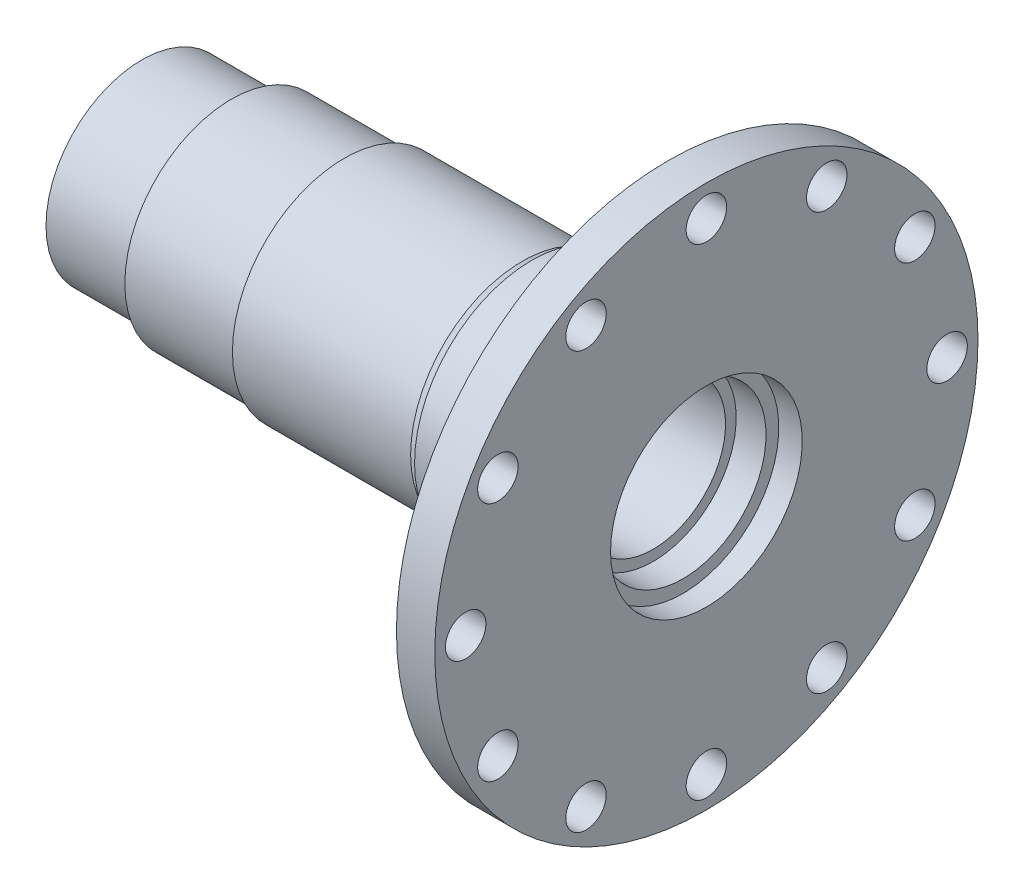
ISO-10303-21;
HEADER;
FILE_DESCRIPTION(('STEP AP214'),'2;1');
FILE_NAME('part.step','',(''),(''),'','','');
FILE_SCHEMA(('AUTOMOTIVE_DESIGN { 1 0 10303 214 1 1 1 1 }'));
ENDSEC;
DATA;
#1=APPLICATION_CONTEXT('core data for automotive mechanical design processes');
#2=APPLICATION_PROTOCOL_DEFINITION('international standard','automotive_design',2000,#1);
#3=PRODUCT_CONTEXT('',#1,'mechanical');
#4=PRODUCT('Part','Part','',(#3));
#5=PRODUCT_RELATED_PRODUCT_CATEGORY('part','',(#4));
#6=PRODUCT_DEFINITION_FORMATION('','',#4);
#7=PRODUCT_DEFINITION_CONTEXT('part definition',#1,'design');
#8=PRODUCT_DEFINITION('design','',#6,#7);
#9=PRODUCT_DEFINITION_SHAPE('','',#8);
#10=(LENGTH_UNIT() NAMED_UNIT(*) SI_UNIT(.MILLI.,.METRE.));
#11=(NAMED_UNIT(*) PLANE_ANGLE_UNIT() SI_UNIT($,.RADIAN.));
#12=(NAMED_UNIT(*) SI_UNIT($,.STERADIAN.) SOLID_ANGLE_UNIT());
#13=UNCERTAINTY_MEASURE_WITH_UNIT(LENGTH_MEASURE(1.E-05),#10,'distance_accuracy_value','');
#14=(GEOMETRIC_REPRESENTATION_CONTEXT(3) GLOBAL_UNCERTAINTY_ASSIGNED_CONTEXT((#13)) GLOBAL_UNIT_ASSIGNED_CONTEXT((#10,
#11,#12)) REPRESENTATION_CONTEXT('',''));
#15=CARTESIAN_POINT('',(0.,0.,0.));
#16=DIRECTION('',(0.,0.,1.));
#17=DIRECTION('',(1.,0.,0.));
#18=AXIS2_PLACEMENT_3D('',#15,#16,#17);
#19=CARTESIAN_POINT('',(0.,0.,0.));
#20=DIRECTION('',(1.,0.,0.));
#21=DIRECTION('',(0.,0.,-1.));
#22=AXIS2_PLACEMENT_3D('',#19,#20,#21);
#23=PLANE('',#22);
#24=CARTESIAN_POINT('',(0.,0.,0.));
#25=DIRECTION('',(-1.,0.,0.));
#26=DIRECTION('',(0.,0.,1.));
#27=AXIS2_PLACEMENT_3D('',#24,#25,#26);
#28=CIRCLE('',#27,31.);
#29=CARTESIAN_POINT('',(0.,0.,31.));
#30=VERTEX_POINT('',#29);
#31=EDGE_CURVE('E138',#30,#30,#28,.T.);
#32=ORIENTED_EDGE('',*,*,#31,.F.);
#33=EDGE_LOOP('',(#32));
#34=FACE_BOUND('',#33,.T.);
#35=CARTESIAN_POINT('',(0.,0.,0.));
#36=DIRECTION('',(-1.,0.,0.));
#37=DIRECTION('',(0.,0.,1.));
#38=AXIS2_PLACEMENT_3D('',#35,#36,#37);
#39=CIRCLE('',#38,45.);
#40=CARTESIAN_POINT('',(0.,0.,45.));
#41=VERTEX_POINT('',#40);
#42=EDGE_CURVE('E11',#41,#41,#39,.T.);
#43=ORIENTED_EDGE('',*,*,#42,.T.);
#44=EDGE_LOOP('',(#43));
#45=FACE_BOUND('',#44,.T.);
#46=ADVANCED_FACE('F50',(#34,#45),#23,.F.);
#47=CARTESIAN_POINT('',(0.,0.,0.));
#48=DIRECTION('',(-1.,0.,0.));
#49=DIRECTION('',(0.,0.,1.));
#50=AXIS2_PLACEMENT_3D('',#47,#48,#49);
#51=CYLINDRICAL_SURFACE('',#50,45.);
#52=ORIENTED_EDGE('',*,*,#42,.F.);
#53=EDGE_LOOP('',(#52));
#54=FACE_BOUND('',#53,.T.);
#55=CARTESIAN_POINT('',(42.,0.,0.));
#56=DIRECTION('',(-1.,0.,0.));
#57=DIRECTION('',(0.,0.,1.));
#58=AXIS2_PLACEMENT_3D('',#55,#56,#57);
#59=CIRCLE('',#58,45.);
#60=CARTESIAN_POINT('',(42.,0.,45.));
#61=VERTEX_POINT('',#60);
#62=EDGE_CURVE('E59',#61,#61,#59,.T.);
#63=ORIENTED_EDGE('',*,*,#62,.T.);
#64=EDGE_LOOP('',(#63));
#65=FACE_BOUND('',#64,.T.);
#66=ADVANCED_FACE('F339',(#54,#65),#51,.T.);
#67=CARTESIAN_POINT('',(42.,45.,0.));
#68=DIRECTION('',(1.,0.,0.));
#69=DIRECTION('',(0.,0.,-1.));
#70=AXIS2_PLACEMENT_3D('',#67,#68,#69);
#71=PLANE('',#70);
#72=ORIENTED_EDGE('',*,*,#62,.F.);
#73=EDGE_LOOP('',(#72));
#74=FACE_BOUND('',#73,.T.);
#75=CARTESIAN_POINT('',(42.,0.,0.));
#76=DIRECTION('',(-1.,0.,0.));
#77=DIRECTION('',(0.,0.,1.));
#78=AXIS2_PLACEMENT_3D('',#75,#76,#77);
#79=CIRCLE('',#78,50.);
#80=CARTESIAN_POINT('',(42.,0.,50.));
#81=VERTEX_POINT('',#80);
#82=EDGE_CURVE('E64',#81,#81,#79,.T.);
#83=ORIENTED_EDGE('',*,*,#82,.T.);
#84=EDGE_LOOP('',(#83));
#85=FACE_BOUND('',#84,.T.);
#86=ADVANCED_FACE('F343',(#74,#85),#71,.F.);
#87=CARTESIAN_POINT('',(0.,0.,0.));
#88=DIRECTION('',(-1.,0.,0.));
#89=DIRECTION('',(0.,0.,1.));
#90=AXIS2_PLACEMENT_3D('',#87,#88,#89);
#91=CYLINDRICAL_SURFACE('',#90,50.);
#92=ORIENTED_EDGE('',*,*,#82,.F.);
#93=EDGE_LOOP('',(#92));
#94=FACE_BOUND('',#93,.T.);
#95=CARTESIAN_POINT('',(95.,0.,0.));
#96=DIRECTION('',(-1.,0.,0.));
#97=DIRECTION('',(0.,0.,1.));
#98=AXIS2_PLACEMENT_3D('',#95,#96,#97);
#99=CIRCLE('',#98,50.);
#100=CARTESIAN_POINT('',(95.,0.,50.));
#101=VERTEX_POINT('',#100);
#102=EDGE_CURVE('E69',#101,#101,#99,.T.);
#103=ORIENTED_EDGE('',*,*,#102,.T.);
#104=EDGE_LOOP('',(#103));
#105=FACE_BOUND('',#104,.T.);
#106=ADVANCED_FACE('F428',(#94,#105),#91,.T.);
#107=CARTESIAN_POINT('',(95.,50.,0.));
#108=DIRECTION('',(1.,0.,0.));
#109=DIRECTION('',(0.,0.,-1.));
#110=AXIS2_PLACEMENT_3D('',#107,#108,#109);
#111=PLANE('',#110);
#112=ORIENTED_EDGE('',*,*,#102,.F.);
#113=EDGE_LOOP('',(#112));
#114=FACE_BOUND('',#113,.T.);
#115=CARTESIAN_POINT('',(95.,0.,0.));
#116=DIRECTION('',(-1.,0.,0.));
#117=DIRECTION('',(0.,0.,1.));
#118=AXIS2_PLACEMENT_3D('',#115,#116,#117);
#119=CIRCLE('',#118,52.5);
#120=CARTESIAN_POINT('',(95.,0.,52.5));
#121=VERTEX_POINT('',#120);
#122=EDGE_CURVE('E84',#121,#121,#119,.T.);
#123=ORIENTED_EDGE('',*,*,#122,.T.);
#124=EDGE_LOOP('',(#123));
#125=FACE_BOUND('',#124,.T.);
#126=ADVANCED_FACE('F423',(#114,#125),#111,.F.);
#127=CARTESIAN_POINT('',(0.,0.,0.));
#128=DIRECTION('',(-1.,0.,0.));
#129=DIRECTION('',(0.,0.,1.));
#130=AXIS2_PLACEMENT_3D('',#127,#128,#129);
#131=CYLINDRICAL_SURFACE('',#130,52.5);
#132=ORIENTED_EDGE('',*,*,#122,.F.);
#133=EDGE_LOOP('',(#132));
#134=FACE_BOUND('',#133,.T.);
#135=CARTESIAN_POINT('',(178.669872981078,0.,0.));
#136=DIRECTION('',(-1.,0.,0.));
#137=DIRECTION('',(0.,0.,1.));
#138=AXIS2_PLACEMENT_3D('',#135,#136,#137);
#139=CIRCLE('',#138,52.5);
#140=CARTESIAN_POINT('',(178.669872981078,0.,52.5));
#141=VERTEX_POINT('',#140);
#142=EDGE_CURVE('E89',#141,#141,#139,.T.);
#143=ORIENTED_EDGE('',*,*,#142,.T.);
#144=EDGE_LOOP('',(#143));
#145=FACE_BOUND('',#144,.T.);
#146=ADVANCED_FACE('F418',(#134,#145),#131,.T.);
#147=CARTESIAN_POINT('',(183.,0.,0.));
#148=DIRECTION('',(1.,0.,0.));
#149=DIRECTION('',(0.,0.,-1.));
#150=AXIS2_PLACEMENT_3D('',#147,#148,#149);
#151=CONICAL_SURFACE('',#150,55.,0.5235987755983);
#152=ORIENTED_EDGE('',*,*,#142,.F.);
#153=EDGE_LOOP('',(#152));
#154=FACE_BOUND('',#153,.T.);
#155=CARTESIAN_POINT('',(183.,0.,0.));
#156=DIRECTION('',(-1.,0.,0.));
#157=DIRECTION('',(0.,0.,1.));
#158=AXIS2_PLACEMENT_3D('',#155,#156,#157);
#159=CIRCLE('',#158,55.);
#160=CARTESIAN_POINT('',(183.,0.,55.));
#161=VERTEX_POINT('',#160);
#162=EDGE_CURVE('E94',#161,#161,#159,.T.);
#163=ORIENTED_EDGE('',*,*,#162,.T.);
#164=EDGE_LOOP('',(#163));
#165=FACE_BOUND('',#164,.T.);
#166=ADVANCED_FACE('F413',(#154,#165),#151,.T.);
#167=CARTESIAN_POINT('',(0.,0.,0.));
#168=DIRECTION('',(-1.,0.,0.));
#169=DIRECTION('',(0.,0.,1.));
#170=AXIS2_PLACEMENT_3D('',#167,#168,#169);
#171=CYLINDRICAL_SURFACE('',#170,55.);
#172=ORIENTED_EDGE('',*,*,#162,.F.);
#173=EDGE_LOOP('',(#172));
#174=FACE_BOUND('',#173,.T.);
#175=CARTESIAN_POINT('',(215.,0.,0.));
#176=DIRECTION('',(-1.,0.,0.));
#177=DIRECTION('',(0.,0.,1.));
#178=AXIS2_PLACEMENT_3D('',#175,#176,#177);
#179=CIRCLE('',#178,55.);
#180=CARTESIAN_POINT('',(215.,0.,55.));
#181=VERTEX_POINT('',#180);
#182=EDGE_CURVE('E102',#181,#181,#179,.T.);
#183=ORIENTED_EDGE('',*,*,#182,.T.);
#184=EDGE_LOOP('',(#183));
#185=FACE_BOUND('',#184,.T.);
#186=ADVANCED_FACE('F408',(#174,#185),#171,.T.);
#187=CARTESIAN_POINT('',(215.,55.,0.));
#188=DIRECTION('',(1.,0.,0.));
#189=DIRECTION('',(0.,0.,-1.));
#190=AXIS2_PLACEMENT_3D('',#187,#188,#189);
#191=PLANE('',#190);
#192=ORIENTED_EDGE('',*,*,#182,.F.);
#193=EDGE_LOOP('',(#192));
#194=FACE_BOUND('',#193,.T.);
#195=CARTESIAN_POINT('',(215.,0.,0.));
#196=DIRECTION('',(-1.,0.,0.));
#197=DIRECTION('',(0.,0.,1.));
#198=AXIS2_PLACEMENT_3D('',#195,#196,#197);
#199=CIRCLE('',#198,62.5);
#200=CARTESIAN_POINT('',(215.,0.,62.5));
#201=VERTEX_POINT('',#200);
#202=EDGE_CURVE('E106',#201,#201,#199,.T.);
#203=ORIENTED_EDGE('',*,*,#202,.T.);
#204=EDGE_LOOP('',(#203));
#205=FACE_BOUND('',#204,.T.);
#206=ADVANCED_FACE('F403',(#194,#205),#191,.F.);
#207=CARTESIAN_POINT('',(0.,0.,0.));
#208=DIRECTION('',(-1.,0.,0.));
#209=DIRECTION('',(0.,0.,1.));
#210=AXIS2_PLACEMENT_3D('',#207,#208,#209);
#211=CYLINDRICAL_SURFACE('',#210,62.5);
#212=ORIENTED_EDGE('',*,*,#202,.F.);
#213=EDGE_LOOP('',(#212));
#214=FACE_BOUND('',#213,.T.);
#215=CARTESIAN_POINT('',(239.,0.,0.));
#216=DIRECTION('',(-1.,0.,0.));
#217=DIRECTION('',(0.,0.,1.));
#218=AXIS2_PLACEMENT_3D('',#215,#216,#217);
#219=CIRCLE('',#218,62.5);
#220=CARTESIAN_POINT('',(239.,0.,62.5));
#221=VERTEX_POINT('',#220);
#222=EDGE_CURVE('E111',#221,#221,#219,.T.);
#223=ORIENTED_EDGE('',*,*,#222,.T.);
#224=EDGE_LOOP('',(#223));
#225=FACE_BOUND('',#224,.T.);
#226=ADVANCED_FACE('F391',(#214,#225),#211,.T.);
#227=CARTESIAN_POINT('',(239.,62.5,0.));
#228=DIRECTION('',(1.,0.,0.));
#229=DIRECTION('',(0.,0.,-1.));
#230=AXIS2_PLACEMENT_3D('',#227,#228,#229);
#231=PLANE('',#230);
#232=ORIENTED_EDGE('',*,*,#222,.F.);
#233=EDGE_LOOP('',(#232));
#234=FACE_BOUND('',#233,.T.);
#235=CARTESIAN_POINT('',(239.,0.,0.));
#236=DIRECTION('',(-1.,0.,0.));
#237=DIRECTION('',(0.,0.,1.));
#238=AXIS2_PLACEMENT_3D('',#235,#236,#237);
#239=CIRCLE('',#238,100.);
#240=CARTESIAN_POINT('',(239.,0.,100.));
#241=VERTEX_POINT('',#240);
#242=EDGE_CURVE('E116',#241,#241,#239,.T.);
#243=ORIENTED_EDGE('',*,*,#242,.T.);
#244=EDGE_LOOP('',(#243));
#245=FACE_BOUND('',#244,.T.);
#246=ADVANCED_FACE('F386',(#234,#245),#231,.F.);
#247=CARTESIAN_POINT('',(0.,0.,0.));
#248=DIRECTION('',(-1.,0.,0.));
#249=DIRECTION('',(0.,0.,1.));
#250=AXIS2_PLACEMENT_3D('',#247,#248,#249);
#251=CYLINDRICAL_SURFACE('',#250,100.);
#252=ORIENTED_EDGE('',*,*,#242,.F.);
#253=EDGE_LOOP('',(#252));
#254=FACE_BOUND('',#253,.T.);
#255=CARTESIAN_POINT('',(247.,0.,0.));
#256=DIRECTION('',(-1.,0.,0.));
#257=DIRECTION('',(0.,0.,1.));
#258=AXIS2_PLACEMENT_3D('',#255,#256,#257);
#259=CIRCLE('',#258,100.);
#260=CARTESIAN_POINT('',(247.,0.,100.));
#261=VERTEX_POINT('',#260);
#262=EDGE_CURVE('E124',#261,#261,#259,.T.);
#263=ORIENTED_EDGE('',*,*,#262,.T.);
#264=EDGE_LOOP('',(#263));
#265=FACE_BOUND('',#264,.T.);
#266=ADVANCED_FACE('F333',(#254,#265),#251,.T.);
#267=CARTESIAN_POINT('',(247.,100.,0.));
#268=DIRECTION('',(1.,0.,0.));
#269=DIRECTION('',(0.,0.,-1.));
#270=AXIS2_PLACEMENT_3D('',#267,#268,#269);
#271=PLANE('',#270);
#272=CARTESIAN_POINT('',(247.,97.8608706276416,-56.5));
#273=DIRECTION('',(1.,0.,0.));
#274=DIRECTION('',(0.,0.,-1.));
#275=AXIS2_PLACEMENT_3D('',#272,#273,#274);
#276=CIRCLE('',#275,9.5);
#277=CARTESIAN_POINT('',(247.,97.8608706276416,-66.));
#278=VERTEX_POINT('',#277);
#279=EDGE_CURVE('E283',#278,#278,#276,.F.);
#280=ORIENTED_EDGE('',*,*,#279,.F.);
#281=EDGE_LOOP('',(#280));
#282=FACE_BOUND('',#281,.T.);
#283=CARTESIAN_POINT('',(247.,56.4999999999999,-97.8608706276416));
#284=DIRECTION('',(1.,0.,0.));
#285=DIRECTION('',(0.,0.,-1.));
#286=AXIS2_PLACEMENT_3D('',#283,#284,#285);
#287=CIRCLE('',#286,9.49999999999999);
#288=CARTESIAN_POINT('',(247.,56.4999999999999,-107.360870627642));
#289=VERTEX_POINT('',#288);
#290=EDGE_CURVE('E275',#289,#289,#287,.F.);
#291=ORIENTED_EDGE('',*,*,#290,.F.);
#292=EDGE_LOOP('',(#291));
#293=FACE_BOUND('',#292,.T.);
#294=CARTESIAN_POINT('',(247.,0.,-113.));
#295=DIRECTION('',(1.,0.,0.));
#296=DIRECTION('',(0.,0.,-1.));
#297=AXIS2_PLACEMENT_3D('',#294,#295,#296);
#298=CIRCLE('',#297,9.49999999999999);
#299=CARTESIAN_POINT('',(247.,0.,-122.5));
#300=VERTEX_POINT('',#299);
#301=EDGE_CURVE('E266',#300,#300,#298,.F.);
#302=ORIENTED_EDGE('',*,*,#301,.F.);
#303=EDGE_LOOP('',(#302));
#304=FACE_BOUND('',#303,.T.);
#305=CARTESIAN_POINT('',(247.,-56.5,-97.8608706276415));
#306=DIRECTION('',(1.,0.,0.));
#307=DIRECTION('',(0.,0.,-1.));
#308=AXIS2_PLACEMENT_3D('',#305,#306,#307);
#309=CIRCLE('',#308,9.49999999999999);
#310=CARTESIAN_POINT('',(247.,-56.5,-107.360870627642));
#311=VERTEX_POINT('',#310);
#312=EDGE_CURVE('E257',#311,#311,#309,.F.);
#313=ORIENTED_EDGE('',*,*,#312,.F.);
#314=EDGE_LOOP('',(#313));
#315=FACE_BOUND('',#314,.T.);
#316=CARTESIAN_POINT('',(247.,-97.8608706276416,-56.5));
#317=DIRECTION('',(1.,0.,0.));
#318=DIRECTION('',(0.,0.,-1.));
#319=AXIS2_PLACEMENT_3D('',#316,#317,#318);
#320=CIRCLE('',#319,9.5);
#321=CARTESIAN_POINT('',(247.,-97.8608706276416,-66.));
#322=VERTEX_POINT('',#321);
#323=EDGE_CURVE('E249',#322,#322,#320,.F.);
#324=ORIENTED_EDGE('',*,*,#323,.F.);
#325=EDGE_LOOP('',(#324));
#326=FACE_BOUND('',#325,.T.);
#327=CARTESIAN_POINT('',(247.,-113.,0.));
#328=DIRECTION('',(1.,0.,0.));
#329=DIRECTION('',(0.,0.,-1.));
#330=AXIS2_PLACEMENT_3D('',#327,#328,#329);
#331=CIRCLE('',#330,9.5);
#332=CARTESIAN_POINT('',(247.,-113.,-9.49999999999998));
#333=VERTEX_POINT('',#332);
#334=EDGE_CURVE('E238',#333,#333,#331,.F.);
#335=ORIENTED_EDGE('',*,*,#334,.F.);
#336=EDGE_LOOP('',(#335));
#337=FACE_BOUND('',#336,.T.);
#338=CARTESIAN_POINT('',(247.,-97.8608706276415,56.5));
#339=DIRECTION('',(1.,0.,0.));
#340=DIRECTION('',(0.,0.,-1.));
#341=AXIS2_PLACEMENT_3D('',#338,#339,#340);
#342=CIRCLE('',#341,9.5);
#343=CARTESIAN_POINT('',(247.,-97.8608706276415,47.));
#344=VERTEX_POINT('',#343);
#345=EDGE_CURVE('E229',#344,#344,#342,.F.);
#346=ORIENTED_EDGE('',*,*,#345,.F.);
#347=EDGE_LOOP('',(#346));
#348=FACE_BOUND('',#347,.T.);
#349=CARTESIAN_POINT('',(247.,-56.5,97.8608706276416));
#350=DIRECTION('',(1.,0.,0.));
#351=DIRECTION('',(0.,0.,-1.));
#352=AXIS2_PLACEMENT_3D('',#349,#350,#351);
#353=CIRCLE('',#352,9.49999999999999);
#354=CARTESIAN_POINT('',(247.,-56.5,88.3608706276416));
#355=VERTEX_POINT('',#354);
#356=EDGE_CURVE('E221',#355,#355,#353,.F.);
#357=ORIENTED_EDGE('',*,*,#356,.F.);
#358=EDGE_LOOP('',(#357));
#359=FACE_BOUND('',#358,.T.);
#360=CARTESIAN_POINT('',(247.,0.,113.));
#361=DIRECTION('',(1.,0.,0.));
#362=DIRECTION('',(0.,0.,-1.));
#363=AXIS2_PLACEMENT_3D('',#360,#361,#362);
#364=CIRCLE('',#363,9.49999999999999);
#365=CARTESIAN_POINT('',(247.,0.,103.5));
#366=VERTEX_POINT('',#365);
#367=EDGE_CURVE('E210',#366,#366,#364,.F.);
#368=ORIENTED_EDGE('',*,*,#367,.F.);
#369=EDGE_LOOP('',(#368));
#370=FACE_BOUND('',#369,.T.);
#371=CARTESIAN_POINT('',(247.,56.5,97.8608706276416));
#372=DIRECTION('',(1.,0.,0.));
#373=DIRECTION('',(0.,0.,-1.));
#374=AXIS2_PLACEMENT_3D('',#371,#372,#373);
#375=CIRCLE('',#374,9.49999999999999);
#376=CARTESIAN_POINT('',(247.,56.5,88.3608706276416));
#377=VERTEX_POINT('',#376);
#378=EDGE_CURVE('E201',#377,#377,#375,.F.);
#379=ORIENTED_EDGE('',*,*,#378,.F.);
#380=EDGE_LOOP('',(#379));
#381=FACE_BOUND('',#380,.T.);
#382=CARTESIAN_POINT('',(247.,97.8608706276416,56.5));
#383=DIRECTION('',(1.,0.,0.));
#384=DIRECTION('',(0.,0.,-1.));
#385=AXIS2_PLACEMENT_3D('',#382,#383,#384);
#386=CIRCLE('',#385,9.5);
#387=CARTESIAN_POINT('',(247.,97.8608706276416,47.));
#388=VERTEX_POINT('',#387);
#389=EDGE_CURVE('E193',#388,#388,#386,.F.);
#390=ORIENTED_EDGE('',*,*,#389,.F.);
#391=EDGE_LOOP('',(#390));
#392=FACE_BOUND('',#391,.T.);
#393=CARTESIAN_POINT('',(247.,113.,0.));
#394=DIRECTION('',(1.,0.,0.));
#395=DIRECTION('',(0.,0.,-1.));
#396=AXIS2_PLACEMENT_3D('',#393,#394,#395);
#397=CIRCLE('',#396,9.5);
#398=CARTESIAN_POINT('',(247.,113.,-9.50000000000001));
#399=VERTEX_POINT('',#398);
#400=EDGE_CURVE('E182',#399,#399,#397,.F.);
#401=ORIENTED_EDGE('',*,*,#400,.F.);
#402=EDGE_LOOP('',(#401));
#403=FACE_BOUND('',#402,.T.);
#404=ORIENTED_EDGE('',*,*,#262,.F.);
#405=EDGE_LOOP('',(#404));
#406=FACE_BOUND('',#405,.T.);
#407=CARTESIAN_POINT('',(247.,0.,0.));
#408=DIRECTION('',(-1.,0.,0.));
#409=DIRECTION('',(0.,0.,1.));
#410=AXIS2_PLACEMENT_3D('',#407,#408,#409);
#411=CIRCLE('',#410,127.5);
#412=CARTESIAN_POINT('',(247.,0.,127.5));
#413=VERTEX_POINT('',#412);
#414=EDGE_CURVE('E128',#413,#413,#411,.T.);
#415=ORIENTED_EDGE('',*,*,#414,.T.);
#416=EDGE_LOOP('',(#415));
#417=FACE_BOUND('',#416,.T.);
#418=ADVANCED_FACE('F328',(#282,#293,#304,#315,#326,#337,#348,#359,#370,#381,#392,#403,#406,
#417),#271,.F.);
#419=CARTESIAN_POINT('',(0.,0.,0.));
#420=DIRECTION('',(-1.,0.,0.));
#421=DIRECTION('',(0.,0.,1.));
#422=AXIS2_PLACEMENT_3D('',#419,#420,#421);
#423=CYLINDRICAL_SURFACE('',#422,127.5);
#424=ORIENTED_EDGE('',*,*,#414,.F.);
#425=EDGE_LOOP('',(#424));
#426=FACE_BOUND('',#425,.T.);
#427=CARTESIAN_POINT('',(265.,0.,0.));
#428=DIRECTION('',(-1.,0.,0.));
#429=DIRECTION('',(0.,0.,1.));
#430=AXIS2_PLACEMENT_3D('',#427,#428,#429);
#431=CIRCLE('',#430,127.5);
#432=CARTESIAN_POINT('',(265.,0.,127.5));
#433=VERTEX_POINT('',#432);
#434=EDGE_CURVE('E133',#433,#433,#431,.T.);
#435=ORIENTED_EDGE('',*,*,#434,.T.);
#436=EDGE_LOOP('',(#435));
#437=FACE_BOUND('',#436,.T.);
#438=ADVANCED_FACE('F299',(#426,#437),#423,.T.);
#439=CARTESIAN_POINT('',(265.,127.5,0.));
#440=DIRECTION('',(-1.,0.,0.));
#441=DIRECTION('',(0.,0.,1.));
#442=AXIS2_PLACEMENT_3D('',#439,#440,#441);
#443=PLANE('',#442);
#444=CARTESIAN_POINT('',(265.,97.8608706276416,-56.5));
#445=DIRECTION('',(1.,0.,0.));
#446=DIRECTION('',(0.,0.,-1.));
#447=AXIS2_PLACEMENT_3D('',#444,#445,#446);
#448=CIRCLE('',#447,9.5);
#449=CARTESIAN_POINT('',(265.,97.8608706276416,-66.));
#450=VERTEX_POINT('',#449);
#451=EDGE_CURVE('E286',#450,#450,#448,.T.);
#452=ORIENTED_EDGE('',*,*,#451,.F.);
#453=EDGE_LOOP('',(#452));
#454=FACE_BOUND('',#453,.T.);
#455=CARTESIAN_POINT('',(265.,56.4999999999999,-97.8608706276416));
#456=DIRECTION('',(1.,0.,0.));
#457=DIRECTION('',(0.,0.,-1.));
#458=AXIS2_PLACEMENT_3D('',#455,#456,#457);
#459=CIRCLE('',#458,9.49999999999999);
#460=CARTESIAN_POINT('',(265.,56.4999999999999,-107.360870627642));
#461=VERTEX_POINT('',#460);
#462=EDGE_CURVE('E278',#461,#461,#459,.T.);
#463=ORIENTED_EDGE('',*,*,#462,.F.);
#464=EDGE_LOOP('',(#463));
#465=FACE_BOUND('',#464,.T.);
#466=CARTESIAN_POINT('',(265.,0.,-113.));
#467=DIRECTION('',(1.,0.,0.));
#468=DIRECTION('',(0.,0.,-1.));
#469=AXIS2_PLACEMENT_3D('',#466,#467,#468);
#470=CIRCLE('',#469,9.49999999999999);
#471=CARTESIAN_POINT('',(265.,0.,-122.5));
#472=VERTEX_POINT('',#471);
#473=EDGE_CURVE('E270',#472,#472,#470,.T.);
#474=ORIENTED_EDGE('',*,*,#473,.F.);
#475=EDGE_LOOP('',(#474));
#476=FACE_BOUND('',#475,.T.);
#477=CARTESIAN_POINT('',(265.,-56.5,-97.8608706276415));
#478=DIRECTION('',(1.,0.,0.));
#479=DIRECTION('',(0.,0.,-1.));
#480=AXIS2_PLACEMENT_3D('',#477,#478,#479);
#481=CIRCLE('',#480,9.49999999999999);
#482=CARTESIAN_POINT('',(265.,-56.5,-107.360870627642));
#483=VERTEX_POINT('',#482);
#484=EDGE_CURVE('E261',#483,#483,#481,.T.);
#485=ORIENTED_EDGE('',*,*,#484,.F.);
#486=EDGE_LOOP('',(#485));
#487=FACE_BOUND('',#486,.T.);
#488=CARTESIAN_POINT('',(265.,-97.8608706276416,-56.5));
#489=DIRECTION('',(1.,0.,0.));
#490=DIRECTION('',(0.,0.,-1.));
#491=AXIS2_PLACEMENT_3D('',#488,#489,#490);
#492=CIRCLE('',#491,9.5);
#493=CARTESIAN_POINT('',(265.,-97.8608706276416,-66.));
#494=VERTEX_POINT('',#493);
#495=EDGE_CURVE('E252',#494,#494,#492,.T.);
#496=ORIENTED_EDGE('',*,*,#495,.F.);
#497=EDGE_LOOP('',(#496));
#498=FACE_BOUND('',#497,.T.);
#499=CARTESIAN_POINT('',(265.,-113.,0.));
#500=DIRECTION('',(1.,0.,0.));
#501=DIRECTION('',(0.,0.,-1.));
#502=AXIS2_PLACEMENT_3D('',#499,#500,#501);
#503=CIRCLE('',#502,9.5);
#504=CARTESIAN_POINT('',(265.,-113.,-9.49999999999998));
#505=VERTEX_POINT('',#504);
#506=EDGE_CURVE('E244',#505,#505,#503,.T.);
#507=ORIENTED_EDGE('',*,*,#506,.F.);
#508=EDGE_LOOP('',(#507));
#509=FACE_BOUND('',#508,.T.);
#510=CARTESIAN_POINT('',(265.,-97.8608706276415,56.5));
#511=DIRECTION('',(1.,0.,0.));
#512=DIRECTION('',(0.,0.,-1.));
#513=AXIS2_PLACEMENT_3D('',#510,#511,#512);
#514=CIRCLE('',#513,9.5);
#515=CARTESIAN_POINT('',(265.,-97.8608706276415,47.));
#516=VERTEX_POINT('',#515);
#517=EDGE_CURVE('E233',#516,#516,#514,.T.);
#518=ORIENTED_EDGE('',*,*,#517,.F.);
#519=EDGE_LOOP('',(#518));
#520=FACE_BOUND('',#519,.T.);
#521=CARTESIAN_POINT('',(265.,-56.5,97.8608706276416));
#522=DIRECTION('',(1.,0.,0.));
#523=DIRECTION('',(0.,0.,-1.));
#524=AXIS2_PLACEMENT_3D('',#521,#522,#523);
#525=CIRCLE('',#524,9.49999999999999);
#526=CARTESIAN_POINT('',(265.,-56.5,88.3608706276416));
#527=VERTEX_POINT('',#526);
#528=EDGE_CURVE('E224',#527,#527,#525,.T.);
#529=ORIENTED_EDGE('',*,*,#528,.F.);
#530=EDGE_LOOP('',(#529));
#531=FACE_BOUND('',#530,.T.);
#532=CARTESIAN_POINT('',(265.,0.,113.));
#533=DIRECTION('',(1.,0.,0.));
#534=DIRECTION('',(0.,0.,-1.));
#535=AXIS2_PLACEMENT_3D('',#532,#533,#534);
#536=CIRCLE('',#535,9.49999999999999);
#537=CARTESIAN_POINT('',(265.,0.,103.5));
#538=VERTEX_POINT('',#537);
#539=EDGE_CURVE('E216',#538,#538,#536,.T.);
#540=ORIENTED_EDGE('',*,*,#539,.F.);
#541=EDGE_LOOP('',(#540));
#542=FACE_BOUND('',#541,.T.);
#543=CARTESIAN_POINT('',(265.,56.5,97.8608706276416));
#544=DIRECTION('',(1.,0.,0.));
#545=DIRECTION('',(0.,0.,-1.));
#546=AXIS2_PLACEMENT_3D('',#543,#544,#545);
#547=CIRCLE('',#546,9.49999999999999);
#548=CARTESIAN_POINT('',(265.,56.5,88.3608706276416));
#549=VERTEX_POINT('',#548);
#550=EDGE_CURVE('E205',#549,#549,#547,.T.);
#551=ORIENTED_EDGE('',*,*,#550,.F.);
#552=EDGE_LOOP('',(#551));
#553=FACE_BOUND('',#552,.T.);
#554=CARTESIAN_POINT('',(265.,97.8608706276416,56.5));
#555=DIRECTION('',(1.,0.,0.));
#556=DIRECTION('',(0.,0.,-1.));
#557=AXIS2_PLACEMENT_3D('',#554,#555,#556);
#558=CIRCLE('',#557,9.5);
#559=CARTESIAN_POINT('',(265.,97.8608706276416,47.));
#560=VERTEX_POINT('',#559);
#561=EDGE_CURVE('E196',#560,#560,#558,.T.);
#562=ORIENTED_EDGE('',*,*,#561,.F.);
#563=EDGE_LOOP('',(#562));
#564=FACE_BOUND('',#563,.T.);
#565=CARTESIAN_POINT('',(265.,113.,0.));
#566=DIRECTION('',(1.,0.,0.));
#567=DIRECTION('',(0.,0.,-1.));
#568=AXIS2_PLACEMENT_3D('',#565,#566,#567);
#569=CIRCLE('',#568,9.5);
#570=CARTESIAN_POINT('',(265.,113.,-9.50000000000001));
#571=VERTEX_POINT('',#570);
#572=EDGE_CURVE('E188',#571,#571,#569,.T.);
#573=ORIENTED_EDGE('',*,*,#572,.F.);
#574=EDGE_LOOP('',(#573));
#575=FACE_BOUND('',#574,.T.);
#576=CARTESIAN_POINT('',(265.,0.,0.));
#577=DIRECTION('',(-1.,0.,0.));
#578=DIRECTION('',(0.,0.,1.));
#579=AXIS2_PLACEMENT_3D('',#576,#577,#578);
#580=CIRCLE('',#579,45.);
#581=CARTESIAN_POINT('',(265.,0.,45.));
#582=VERTEX_POINT('',#581);
#583=EDGE_CURVE('E177',#582,#582,#580,.T.);
#584=ORIENTED_EDGE('',*,*,#583,.T.);
#585=EDGE_LOOP('',(#584));
#586=FACE_BOUND('',#585,.T.);
#587=ORIENTED_EDGE('',*,*,#434,.F.);
#588=EDGE_LOOP('',(#587));
#589=FACE_BOUND('',#588,.T.);
#590=ADVANCED_FACE('F295',(#454,#465,#476,#487,#498,#509,#520,#531,#542,#553,#564,#575,#586,
#589),#443,.F.);
#591=CARTESIAN_POINT('',(0.,0.,0.));
#592=DIRECTION('',(-1.,0.,0.));
#593=DIRECTION('',(0.,0.,1.));
#594=AXIS2_PLACEMENT_3D('',#591,#592,#593);
#595=CYLINDRICAL_SURFACE('',#594,31.);
#596=ORIENTED_EDGE('',*,*,#31,.T.);
#597=EDGE_LOOP('',(#596));
#598=FACE_BOUND('',#597,.T.);
#599=CARTESIAN_POINT('',(203.5,0.,0.));
#600=DIRECTION('',(-1.,0.,0.));
#601=DIRECTION('',(0.,0.,1.));
#602=AXIS2_PLACEMENT_3D('',#599,#600,#601);
#603=CIRCLE('',#602,31.);
#604=CARTESIAN_POINT('',(203.5,0.,31.));
#605=VERTEX_POINT('',#604);
#606=EDGE_CURVE('E146',#605,#605,#603,.T.);
#607=ORIENTED_EDGE('',*,*,#606,.F.);
#608=EDGE_LOOP('',(#607));
#609=FACE_BOUND('',#608,.T.);
#610=ADVANCED_FACE('F298',(#598,#609),#595,.F.);
#611=CARTESIAN_POINT('',(203.5,31.,0.));
#612=DIRECTION('',(1.,0.,0.));
#613=DIRECTION('',(0.,0.,-1.));
#614=AXIS2_PLACEMENT_3D('',#611,#612,#613);
#615=PLANE('',#614);
#616=ORIENTED_EDGE('',*,*,#606,.T.);
#617=EDGE_LOOP('',(#616));
#618=FACE_BOUND('',#617,.T.);
#619=CARTESIAN_POINT('',(203.5,0.,0.));
#620=DIRECTION('',(-1.,0.,0.));
#621=DIRECTION('',(0.,0.,1.));
#622=AXIS2_PLACEMENT_3D('',#619,#620,#621);
#623=CIRCLE('',#622,34.);
#624=CARTESIAN_POINT('',(203.5,0.,34.));
#625=VERTEX_POINT('',#624);
#626=EDGE_CURVE('E150',#625,#625,#623,.T.);
#627=ORIENTED_EDGE('',*,*,#626,.F.);
#628=EDGE_LOOP('',(#627));
#629=FACE_BOUND('',#628,.T.);
#630=ADVANCED_FACE('F512',(#618,#629),#615,.T.);
#631=CARTESIAN_POINT('',(0.,0.,0.));
#632=DIRECTION('',(-1.,0.,0.));
#633=DIRECTION('',(0.,0.,1.));
#634=AXIS2_PLACEMENT_3D('',#631,#632,#633);
#635=CYLINDRICAL_SURFACE('',#634,34.);
#636=ORIENTED_EDGE('',*,*,#626,.T.);
#637=EDGE_LOOP('',(#636));
#638=FACE_BOUND('',#637,.T.);
#639=CARTESIAN_POINT('',(240.,0.,0.));
#640=DIRECTION('',(-1.,0.,0.));
#641=DIRECTION('',(0.,0.,1.));
#642=AXIS2_PLACEMENT_3D('',#639,#640,#641);
#643=CIRCLE('',#642,34.);
#644=CARTESIAN_POINT('',(240.,0.,34.));
#645=VERTEX_POINT('',#644);
#646=EDGE_CURVE('E155',#645,#645,#643,.T.);
#647=ORIENTED_EDGE('',*,*,#646,.F.);
#648=EDGE_LOOP('',(#647));
#649=FACE_BOUND('',#648,.T.);
#650=ADVANCED_FACE('F521',(#638,#649),#635,.F.);
#651=CARTESIAN_POINT('',(240.,34.,0.));
#652=DIRECTION('',(1.,0.,0.));
#653=DIRECTION('',(0.,0.,-1.));
#654=AXIS2_PLACEMENT_3D('',#651,#652,#653);
#655=PLANE('',#654);
#656=ORIENTED_EDGE('',*,*,#646,.T.);
#657=EDGE_LOOP('',(#656));
#658=FACE_BOUND('',#657,.T.);
#659=CARTESIAN_POINT('',(240.,0.,0.));
#660=DIRECTION('',(-1.,0.,0.));
#661=DIRECTION('',(0.,0.,1.));
#662=AXIS2_PLACEMENT_3D('',#659,#660,#661);
#663=CIRCLE('',#662,39.);
#664=CARTESIAN_POINT('',(240.,0.,39.));
#665=VERTEX_POINT('',#664);
#666=EDGE_CURVE('E160',#665,#665,#663,.T.);
#667=ORIENTED_EDGE('',*,*,#666,.F.);
#668=EDGE_LOOP('',(#667));
#669=FACE_BOUND('',#668,.T.);
#670=ADVANCED_FACE('F531',(#658,#669),#655,.T.);
#671=CARTESIAN_POINT('',(0.,0.,0.));
#672=DIRECTION('',(-1.,0.,0.));
#673=DIRECTION('',(0.,0.,1.));
#674=AXIS2_PLACEMENT_3D('',#671,#672,#673);
#675=CYLINDRICAL_SURFACE('',#674,39.);
#676=ORIENTED_EDGE('',*,*,#666,.T.);
#677=EDGE_LOOP('',(#676));
#678=FACE_BOUND('',#677,.T.);
#679=CARTESIAN_POINT('',(254.,0.,0.));
#680=DIRECTION('',(-1.,0.,0.));
#681=DIRECTION('',(0.,0.,1.));
#682=AXIS2_PLACEMENT_3D('',#679,#680,#681);
#683=CIRCLE('',#682,39.);
#684=CARTESIAN_POINT('',(254.,0.,39.));
#685=VERTEX_POINT('',#684);
#686=EDGE_CURVE('E168',#685,#685,#683,.T.);
#687=ORIENTED_EDGE('',*,*,#686,.F.);
#688=EDGE_LOOP('',(#687));
#689=FACE_BOUND('',#688,.T.);
#690=ADVANCED_FACE('F541',(#678,#689),#675,.F.);
#691=CARTESIAN_POINT('',(254.,39.,0.));
#692=DIRECTION('',(1.,0.,0.));
#693=DIRECTION('',(0.,0.,-1.));
#694=AXIS2_PLACEMENT_3D('',#691,#692,#693);
#695=PLANE('',#694);
#696=ORIENTED_EDGE('',*,*,#686,.T.);
#697=EDGE_LOOP('',(#696));
#698=FACE_BOUND('',#697,.T.);
#699=CARTESIAN_POINT('',(254.,0.,0.));
#700=DIRECTION('',(-1.,0.,0.));
#701=DIRECTION('',(0.,0.,1.));
#702=AXIS2_PLACEMENT_3D('',#699,#700,#701);
#703=CIRCLE('',#702,45.);
#704=CARTESIAN_POINT('',(254.,0.,45.));
#705=VERTEX_POINT('',#704);
#706=EDGE_CURVE('E172',#705,#705,#703,.T.);
#707=ORIENTED_EDGE('',*,*,#706,.F.);
#708=EDGE_LOOP('',(#707));
#709=FACE_BOUND('',#708,.T.);
#710=ADVANCED_FACE('F551',(#698,#709),#695,.T.);
#711=CARTESIAN_POINT('',(0.,0.,0.));
#712=DIRECTION('',(-1.,0.,0.));
#713=DIRECTION('',(0.,0.,1.));
#714=AXIS2_PLACEMENT_3D('',#711,#712,#713);
#715=CYLINDRICAL_SURFACE('',#714,45.);
#716=ORIENTED_EDGE('',*,*,#706,.T.);
#717=EDGE_LOOP('',(#716));
#718=FACE_BOUND('',#717,.T.);
#719=ORIENTED_EDGE('',*,*,#583,.F.);
#720=EDGE_LOOP('',(#719));
#721=FACE_BOUND('',#720,.T.);
#722=ADVANCED_FACE('F561',(#718,#721),#715,.F.);
#723=CARTESIAN_POINT('',(265.,113.,0.));
#724=DIRECTION('',(-1.,0.,0.));
#725=DIRECTION('',(0.,0.,1.));
#726=AXIS2_PLACEMENT_3D('',#723,#724,#725);
#727=CYLINDRICAL_SURFACE('',#726,9.5);
#728=ORIENTED_EDGE('',*,*,#572,.T.);
#729=EDGE_LOOP('',(#728));
#730=FACE_BOUND('',#729,.T.);
#731=ORIENTED_EDGE('',*,*,#400,.T.);
#732=EDGE_LOOP('',(#731));
#733=FACE_BOUND('',#732,.T.);
#734=ADVANCED_FACE('F571',(#730,#733),#727,.F.);
#735=CARTESIAN_POINT('',(265.,97.8608706276416,56.5));
#736=DIRECTION('',(-1.,0.,0.));
#737=DIRECTION('',(0.,0.,1.));
#738=AXIS2_PLACEMENT_3D('',#735,#736,#737);
#739=CYLINDRICAL_SURFACE('',#738,9.5);
#740=ORIENTED_EDGE('',*,*,#561,.T.);
#741=EDGE_LOOP('',(#740));
#742=FACE_BOUND('',#741,.T.);
#743=ORIENTED_EDGE('',*,*,#389,.T.);
#744=EDGE_LOOP('',(#743));
#745=FACE_BOUND('',#744,.T.);
#746=ADVANCED_FACE('F581',(#742,#745),#739,.F.);
#747=CARTESIAN_POINT('',(265.,56.5,97.8608706276416));
#748=DIRECTION('',(-1.,0.,0.));
#749=DIRECTION('',(0.,0.,1.));
#750=AXIS2_PLACEMENT_3D('',#747,#748,#749);
#751=CYLINDRICAL_SURFACE('',#750,9.49999999999999);
#752=ORIENTED_EDGE('',*,*,#550,.T.);
#753=EDGE_LOOP('',(#752));
#754=FACE_BOUND('',#753,.T.);
#755=ORIENTED_EDGE('',*,*,#378,.T.);
#756=EDGE_LOOP('',(#755));
#757=FACE_BOUND('',#756,.T.);
#758=ADVANCED_FACE('F591',(#754,#757),#751,.F.);
#759=CARTESIAN_POINT('',(265.,0.,113.));
#760=DIRECTION('',(-1.,0.,0.));
#761=DIRECTION('',(0.,0.,1.));
#762=AXIS2_PLACEMENT_3D('',#759,#760,#761);
#763=CYLINDRICAL_SURFACE('',#762,9.49999999999999);
#764=ORIENTED_EDGE('',*,*,#539,.T.);
#765=EDGE_LOOP('',(#764));
#766=FACE_BOUND('',#765,.T.);
#767=ORIENTED_EDGE('',*,*,#367,.T.);
#768=EDGE_LOOP('',(#767));
#769=FACE_BOUND('',#768,.T.);
#770=ADVANCED_FACE('F601',(#766,#769),#763,.F.);
#771=CARTESIAN_POINT('',(265.,-56.5,97.8608706276416));
#772=DIRECTION('',(-1.,0.,0.));
#773=DIRECTION('',(0.,0.,1.));
#774=AXIS2_PLACEMENT_3D('',#771,#772,#773);
#775=CYLINDRICAL_SURFACE('',#774,9.49999999999999);
#776=ORIENTED_EDGE('',*,*,#528,.T.);
#777=EDGE_LOOP('',(#776));
#778=FACE_BOUND('',#777,.T.);
#779=ORIENTED_EDGE('',*,*,#356,.T.);
#780=EDGE_LOOP('',(#779));
#781=FACE_BOUND('',#780,.T.);
#782=ADVANCED_FACE('F611',(#778,#781),#775,.F.);
#783=CARTESIAN_POINT('',(265.,-97.8608706276415,56.5));
#784=DIRECTION('',(-1.,0.,0.));
#785=DIRECTION('',(0.,0.,1.));
#786=AXIS2_PLACEMENT_3D('',#783,#784,#785);
#787=CYLINDRICAL_SURFACE('',#786,9.5);
#788=ORIENTED_EDGE('',*,*,#517,.T.);
#789=EDGE_LOOP('',(#788));
#790=FACE_BOUND('',#789,.T.);
#791=ORIENTED_EDGE('',*,*,#345,.T.);
#792=EDGE_LOOP('',(#791));
#793=FACE_BOUND('',#792,.T.);
#794=ADVANCED_FACE('F621',(#790,#793),#787,.F.);
#795=CARTESIAN_POINT('',(265.,-113.,0.));
#796=DIRECTION('',(-1.,0.,0.));
#797=DIRECTION('',(0.,0.,1.));
#798=AXIS2_PLACEMENT_3D('',#795,#796,#797);
#799=CYLINDRICAL_SURFACE('',#798,9.5);
#800=ORIENTED_EDGE('',*,*,#506,.T.);
#801=EDGE_LOOP('',(#800));
#802=FACE_BOUND('',#801,.T.);
#803=ORIENTED_EDGE('',*,*,#334,.T.);
#804=EDGE_LOOP('',(#803));
#805=FACE_BOUND('',#804,.T.);
#806=ADVANCED_FACE('F631',(#802,#805),#799,.F.);
#807=CARTESIAN_POINT('',(265.,-97.8608706276416,-56.5));
#808=DIRECTION('',(-1.,0.,0.));
#809=DIRECTION('',(0.,0.,1.));
#810=AXIS2_PLACEMENT_3D('',#807,#808,#809);
#811=CYLINDRICAL_SURFACE('',#810,9.5);
#812=ORIENTED_EDGE('',*,*,#495,.T.);
#813=EDGE_LOOP('',(#812));
#814=FACE_BOUND('',#813,.T.);
#815=ORIENTED_EDGE('',*,*,#323,.T.);
#816=EDGE_LOOP('',(#815));
#817=FACE_BOUND('',#816,.T.);
#818=ADVANCED_FACE('F641',(#814,#817),#811,.F.);
#819=CARTESIAN_POINT('',(265.,-56.5,-97.8608706276415));
#820=DIRECTION('',(-1.,0.,0.));
#821=DIRECTION('',(0.,0.,1.));
#822=AXIS2_PLACEMENT_3D('',#819,#820,#821);
#823=CYLINDRICAL_SURFACE('',#822,9.49999999999999);
#824=ORIENTED_EDGE('',*,*,#484,.T.);
#825=EDGE_LOOP('',(#824));
#826=FACE_BOUND('',#825,.T.);
#827=ORIENTED_EDGE('',*,*,#312,.T.);
#828=EDGE_LOOP('',(#827));
#829=FACE_BOUND('',#828,.T.);
#830=ADVANCED_FACE('F651',(#826,#829),#823,.F.);
#831=CARTESIAN_POINT('',(265.,0.,-113.));
#832=DIRECTION('',(-1.,0.,0.));
#833=DIRECTION('',(0.,0.,1.));
#834=AXIS2_PLACEMENT_3D('',#831,#832,#833);
#835=CYLINDRICAL_SURFACE('',#834,9.49999999999999);
#836=ORIENTED_EDGE('',*,*,#473,.T.);
#837=EDGE_LOOP('',(#836));
#838=FACE_BOUND('',#837,.T.);
#839=ORIENTED_EDGE('',*,*,#301,.T.);
#840=EDGE_LOOP('',(#839));
#841=FACE_BOUND('',#840,.T.);
#842=ADVANCED_FACE('F361',(#838,#841),#835,.F.);
#843=CARTESIAN_POINT('',(265.,56.4999999999999,-97.8608706276416));
#844=DIRECTION('',(-1.,0.,0.));
#845=DIRECTION('',(0.,0.,1.));
#846=AXIS2_PLACEMENT_3D('',#843,#844,#845);
#847=CYLINDRICAL_SURFACE('',#846,9.49999999999999);
#848=ORIENTED_EDGE('',*,*,#462,.T.);
#849=EDGE_LOOP('',(#848));
#850=FACE_BOUND('',#849,.T.);
#851=ORIENTED_EDGE('',*,*,#290,.T.);
#852=EDGE_LOOP('',(#851));
#853=FACE_BOUND('',#852,.T.);
#854=ADVANCED_FACE('F670',(#850,#853),#847,.F.);
#855=CARTESIAN_POINT('',(265.,97.8608706276416,-56.5));
#856=DIRECTION('',(-1.,0.,0.));
#857=DIRECTION('',(0.,0.,1.));
#858=AXIS2_PLACEMENT_3D('',#855,#856,#857);
#859=CYLINDRICAL_SURFACE('',#858,9.5);
#860=ORIENTED_EDGE('',*,*,#451,.T.);
#861=EDGE_LOOP('',(#860));
#862=FACE_BOUND('',#861,.T.);
#863=ORIENTED_EDGE('',*,*,#279,.T.);
#864=EDGE_LOOP('',(#863));
#865=FACE_BOUND('',#864,.T.);
#866=ADVANCED_FACE('F292',(#862,#865),#859,.F.);
#867=CLOSED_SHELL('',(#46,#66,#86,#106,#126,#146,#166,#186,#206,#226,#246,#266,#418,#438,#590,
#610,#630,#650,#670,#690,#710,#722,#734,#746,#758,#770,#782,#794,#806,#818,#830,#842,#854,#866));
#868=MANIFOLD_SOLID_BREP('B2',#867);
#869=ADVANCED_BREP_SHAPE_REPRESENTATION('',(#18,#868),#14);
#870=SHAPE_DEFINITION_REPRESENTATION(#9,#869);
ENDSEC;
END-ISO-10303-21;
